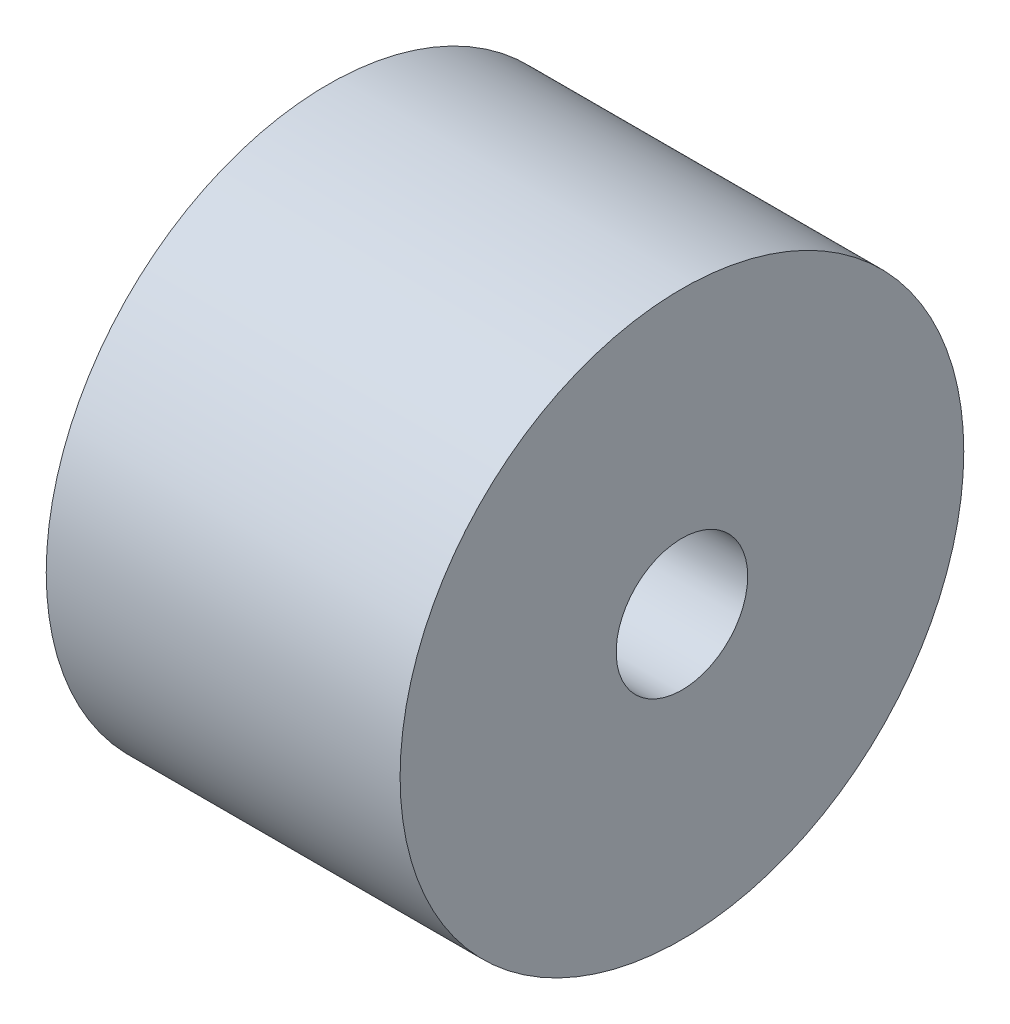
ISO-10303-21;
HEADER;
FILE_DESCRIPTION(('STEP AP214'),'2;1');
FILE_NAME('part.step','',(''),(''),'','','');
FILE_SCHEMA(('AUTOMOTIVE_DESIGN { 1 0 10303 214 1 1 1 1 }'));
ENDSEC;
DATA;
#1=APPLICATION_CONTEXT('core data for automotive mechanical design processes');
#2=APPLICATION_PROTOCOL_DEFINITION('international standard','automotive_design',2000,#1);
#3=PRODUCT_CONTEXT('',#1,'mechanical');
#4=PRODUCT('Part','Part','',(#3));
#5=PRODUCT_RELATED_PRODUCT_CATEGORY('part','',(#4));
#6=PRODUCT_DEFINITION_FORMATION('','',#4);
#7=PRODUCT_DEFINITION_CONTEXT('part definition',#1,'design');
#8=PRODUCT_DEFINITION('design','',#6,#7);
#9=PRODUCT_DEFINITION_SHAPE('','',#8);
#10=(LENGTH_UNIT() NAMED_UNIT(*) SI_UNIT(.MILLI.,.METRE.));
#11=(NAMED_UNIT(*) PLANE_ANGLE_UNIT() SI_UNIT($,.RADIAN.));
#12=(NAMED_UNIT(*) SI_UNIT($,.STERADIAN.) SOLID_ANGLE_UNIT());
#13=UNCERTAINTY_MEASURE_WITH_UNIT(LENGTH_MEASURE(1.E-05),#10,'distance_accuracy_value','');
#14=(GEOMETRIC_REPRESENTATION_CONTEXT(3) GLOBAL_UNCERTAINTY_ASSIGNED_CONTEXT((#13)) GLOBAL_UNIT_ASSIGNED_CONTEXT((#10,
#11,#12)) REPRESENTATION_CONTEXT('',''));
#15=CARTESIAN_POINT('',(0.,0.,0.));
#16=DIRECTION('',(0.,0.,1.));
#17=DIRECTION('',(1.,0.,0.));
#18=AXIS2_PLACEMENT_3D('',#15,#16,#17);
#19=CARTESIAN_POINT('',(11.3,0.,0.));
#20=DIRECTION('',(1.,0.,0.));
#21=DIRECTION('',(0.,0.,-1.));
#22=AXIS2_PLACEMENT_3D('',#19,#20,#21);
#23=PLANE('',#22);
#24=CARTESIAN_POINT('',(11.3,0.,0.));
#25=DIRECTION('',(1.,0.,0.));
#26=DIRECTION('',(0.,0.,-1.));
#27=AXIS2_PLACEMENT_3D('',#24,#25,#26);
#28=CIRCLE('',#27,9.);
#29=CARTESIAN_POINT('',(11.3,0.,-9.));
#30=VERTEX_POINT('',#29);
#31=EDGE_CURVE('E10',#30,#30,#28,.T.);
#32=ORIENTED_EDGE('',*,*,#31,.T.);
#33=EDGE_LOOP('',(#32));
#34=FACE_BOUND('',#33,.T.);
#35=CARTESIAN_POINT('',(11.3,0.,0.));
#36=DIRECTION('',(1.,0.,0.));
#37=DIRECTION('',(0.,0.,-1.));
#38=AXIS2_PLACEMENT_3D('',#35,#36,#37);
#39=CIRCLE('',#38,2.1);
#40=CARTESIAN_POINT('',(11.3,0.,-2.1));
#41=VERTEX_POINT('',#40);
#42=EDGE_CURVE('E46',#41,#41,#39,.T.);
#43=ORIENTED_EDGE('',*,*,#42,.F.);
#44=EDGE_LOOP('',(#43));
#45=FACE_BOUND('',#44,.T.);
#46=ADVANCED_FACE('F35',(#34,#45),#23,.T.);
#47=CARTESIAN_POINT('',(0.,0.,0.));
#48=DIRECTION('',(1.,0.,0.));
#49=DIRECTION('',(0.,0.,-1.));
#50=AXIS2_PLACEMENT_3D('',#47,#48,#49);
#51=PLANE('',#50);
#52=CARTESIAN_POINT('',(0.,0.,0.));
#53=DIRECTION('',(1.,0.,0.));
#54=DIRECTION('',(0.,0.,-1.));
#55=AXIS2_PLACEMENT_3D('',#52,#53,#54);
#56=CIRCLE('',#55,9.);
#57=CARTESIAN_POINT('',(0.,0.,-9.));
#58=VERTEX_POINT('',#57);
#59=EDGE_CURVE('E39',#58,#58,#56,.T.);
#60=ORIENTED_EDGE('',*,*,#59,.F.);
#61=EDGE_LOOP('',(#60));
#62=FACE_BOUND('',#61,.T.);
#63=CARTESIAN_POINT('',(0.,0.,0.));
#64=DIRECTION('',(1.,0.,0.));
#65=DIRECTION('',(0.,0.,-1.));
#66=AXIS2_PLACEMENT_3D('',#63,#64,#65);
#67=CIRCLE('',#66,2.1);
#68=CARTESIAN_POINT('',(0.,0.,-2.1));
#69=VERTEX_POINT('',#68);
#70=EDGE_CURVE('E48',#69,#69,#67,.T.);
#71=ORIENTED_EDGE('',*,*,#70,.T.);
#72=EDGE_LOOP('',(#71));
#73=FACE_BOUND('',#72,.T.);
#74=ADVANCED_FACE('F58',(#62,#73),#51,.F.);
#75=CARTESIAN_POINT('',(11.3,0.,0.));
#76=DIRECTION('',(-1.,0.,0.));
#77=DIRECTION('',(0.,0.,1.));
#78=AXIS2_PLACEMENT_3D('',#75,#76,#77);
#79=CYLINDRICAL_SURFACE('',#78,9.);
#80=ORIENTED_EDGE('',*,*,#31,.F.);
#81=EDGE_LOOP('',(#80));
#82=FACE_BOUND('',#81,.T.);
#83=ORIENTED_EDGE('',*,*,#59,.T.);
#84=EDGE_LOOP('',(#83));
#85=FACE_BOUND('',#84,.T.);
#86=ADVANCED_FACE('F37',(#82,#85),#79,.T.);
#87=CARTESIAN_POINT('',(11.3,0.,0.));
#88=DIRECTION('',(-1.,0.,0.));
#89=DIRECTION('',(0.,0.,1.));
#90=AXIS2_PLACEMENT_3D('',#87,#88,#89);
#91=CYLINDRICAL_SURFACE('',#90,2.1);
#92=ORIENTED_EDGE('',*,*,#42,.T.);
#93=EDGE_LOOP('',(#92));
#94=FACE_BOUND('',#93,.T.);
#95=ORIENTED_EDGE('',*,*,#70,.F.);
#96=EDGE_LOOP('',(#95));
#97=FACE_BOUND('',#96,.T.);
#98=ADVANCED_FACE('F54',(#94,#97),#91,.F.);
#99=CLOSED_SHELL('',(#46,#74,#86,#98));
#100=MANIFOLD_SOLID_BREP('B2',#99);
#101=ADVANCED_BREP_SHAPE_REPRESENTATION('',(#18,#100),#14);
#102=SHAPE_DEFINITION_REPRESENTATION(#9,#101);
ENDSEC;
END-ISO-10303-21;
